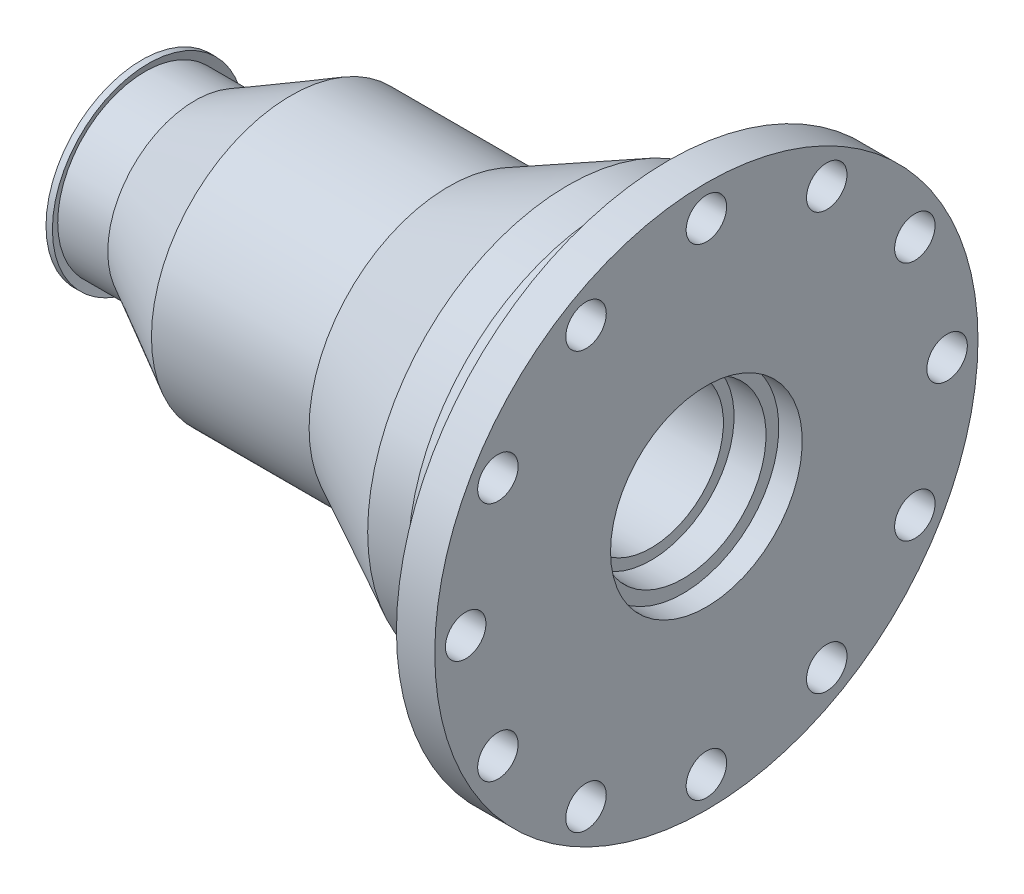
ISO-10303-21;
HEADER;
FILE_DESCRIPTION(('STEP AP214'),'2;1');
FILE_NAME('part.step','',(''),(''),'','','');
FILE_SCHEMA(('AUTOMOTIVE_DESIGN { 1 0 10303 214 1 1 1 1 }'));
ENDSEC;
DATA;
#1=APPLICATION_CONTEXT('core data for automotive mechanical design processes');
#2=APPLICATION_PROTOCOL_DEFINITION('international standard','automotive_design',2000,#1);
#3=PRODUCT_CONTEXT('',#1,'mechanical');
#4=PRODUCT('Part','Part','',(#3));
#5=PRODUCT_RELATED_PRODUCT_CATEGORY('part','',(#4));
#6=PRODUCT_DEFINITION_FORMATION('','',#4);
#7=PRODUCT_DEFINITION_CONTEXT('part definition',#1,'design');
#8=PRODUCT_DEFINITION('design','',#6,#7);
#9=PRODUCT_DEFINITION_SHAPE('','',#8);
#10=(LENGTH_UNIT() NAMED_UNIT(*) SI_UNIT(.MILLI.,.METRE.));
#11=(NAMED_UNIT(*) PLANE_ANGLE_UNIT() SI_UNIT($,.RADIAN.));
#12=(NAMED_UNIT(*) SI_UNIT($,.STERADIAN.) SOLID_ANGLE_UNIT());
#13=UNCERTAINTY_MEASURE_WITH_UNIT(LENGTH_MEASURE(1.E-05),#10,'distance_accuracy_value','');
#14=(GEOMETRIC_REPRESENTATION_CONTEXT(3) GLOBAL_UNCERTAINTY_ASSIGNED_CONTEXT((#13)) GLOBAL_UNIT_ASSIGNED_CONTEXT((#10,
#11,#12)) REPRESENTATION_CONTEXT('',''));
#15=CARTESIAN_POINT('',(0.,0.,0.));
#16=DIRECTION('',(0.,0.,1.));
#17=DIRECTION('',(1.,0.,0.));
#18=AXIS2_PLACEMENT_3D('',#15,#16,#17);
#19=CARTESIAN_POINT('',(0.,0.,0.));
#20=DIRECTION('',(1.,0.,0.));
#21=DIRECTION('',(0.,0.,-1.));
#22=AXIS2_PLACEMENT_3D('',#19,#20,#21);
#23=PLANE('',#22);
#24=CARTESIAN_POINT('',(0.,0.,0.));
#25=DIRECTION('',(-1.,0.,0.));
#26=DIRECTION('',(0.,0.,1.));
#27=AXIS2_PLACEMENT_3D('',#24,#25,#26);
#28=CIRCLE('',#27,31.);
#29=CARTESIAN_POINT('',(0.,0.,31.));
#30=VERTEX_POINT('',#29);
#31=EDGE_CURVE('E90',#30,#30,#28,.T.);
#32=ORIENTED_EDGE('',*,*,#31,.F.);
#33=EDGE_LOOP('',(#32));
#34=FACE_BOUND('',#33,.T.);
#35=CARTESIAN_POINT('',(0.,0.,0.));
#36=DIRECTION('',(-1.,0.,0.));
#37=DIRECTION('',(0.,0.,1.));
#38=AXIS2_PLACEMENT_3D('',#35,#36,#37);
#39=CIRCLE('',#38,45.);
#40=CARTESIAN_POINT('',(0.,0.,45.));
#41=VERTEX_POINT('',#40);
#42=EDGE_CURVE('E10',#41,#41,#39,.T.);
#43=ORIENTED_EDGE('',*,*,#42,.T.);
#44=EDGE_LOOP('',(#43));
#45=FACE_BOUND('',#44,.T.);
#46=ADVANCED_FACE('F41',(#34,#45),#23,.F.);
#47=CARTESIAN_POINT('',(0.,0.,0.));
#48=DIRECTION('',(-1.,0.,0.));
#49=DIRECTION('',(0.,0.,1.));
#50=AXIS2_PLACEMENT_3D('',#47,#48,#49);
#51=CYLINDRICAL_SURFACE('',#50,45.);
#52=ORIENTED_EDGE('',*,*,#42,.F.);
#53=EDGE_LOOP('',(#52));
#54=FACE_BOUND('',#53,.T.);
#55=CARTESIAN_POINT('',(3.,0.,0.));
#56=DIRECTION('',(-1.,0.,0.));
#57=DIRECTION('',(0.,0.,1.));
#58=AXIS2_PLACEMENT_3D('',#55,#56,#57);
#59=CIRCLE('',#58,45.);
#60=CARTESIAN_POINT('',(3.,0.,45.));
#61=VERTEX_POINT('',#60);
#62=EDGE_CURVE('E47',#61,#61,#59,.T.);
#63=ORIENTED_EDGE('',*,*,#62,.T.);
#64=EDGE_LOOP('',(#63));
#65=FACE_BOUND('',#64,.T.);
#66=ADVANCED_FACE('F235',(#54,#65),#51,.T.);
#67=CARTESIAN_POINT('',(1.5,0.,0.));
#68=DIRECTION('',(1.,0.,0.));
#69=DIRECTION('',(0.,0.,-1.));
#70=AXIS2_PLACEMENT_3D('',#67,#68,#69);
#71=CONICAL_SURFACE('',#70,41.,1.21202565652432);
#72=ORIENTED_EDGE('',*,*,#62,.F.);
#73=EDGE_LOOP('',(#72));
#74=FACE_BOUND('',#73,.T.);
#75=CARTESIAN_POINT('',(1.5,0.,0.));
#76=DIRECTION('',(-1.,0.,0.));
#77=DIRECTION('',(0.,0.,1.));
#78=AXIS2_PLACEMENT_3D('',#75,#76,#77);
#79=CIRCLE('',#78,41.);
#80=CARTESIAN_POINT('',(1.5,0.,41.));
#81=VERTEX_POINT('',#80);
#82=EDGE_CURVE('E51',#81,#81,#79,.T.);
#83=ORIENTED_EDGE('',*,*,#82,.T.);
#84=EDGE_LOOP('',(#83));
#85=FACE_BOUND('',#84,.T.);
#86=ADVANCED_FACE('F241',(#74,#85),#71,.F.);
#87=CARTESIAN_POINT('',(0.,0.,0.));
#88=DIRECTION('',(-1.,0.,0.));
#89=DIRECTION('',(0.,0.,1.));
#90=AXIS2_PLACEMENT_3D('',#87,#88,#89);
#91=CYLINDRICAL_SURFACE('',#90,41.);
#92=ORIENTED_EDGE('',*,*,#82,.F.);
#93=EDGE_LOOP('',(#92));
#94=FACE_BOUND('',#93,.T.);
#95=CARTESIAN_POINT('',(25.,0.,0.));
#96=DIRECTION('',(-1.,0.,0.));
#97=DIRECTION('',(0.,0.,1.));
#98=AXIS2_PLACEMENT_3D('',#95,#96,#97);
#99=CIRCLE('',#98,41.);
#100=CARTESIAN_POINT('',(25.,0.,41.));
#101=VERTEX_POINT('',#100);
#102=EDGE_CURVE('E55',#101,#101,#99,.T.);
#103=ORIENTED_EDGE('',*,*,#102,.T.);
#104=EDGE_LOOP('',(#103));
#105=FACE_BOUND('',#104,.T.);
#106=ADVANCED_FACE('F515',(#94,#105),#91,.T.);
#107=CARTESIAN_POINT('',(70.,0.,0.));
#108=DIRECTION('',(1.,0.,0.));
#109=DIRECTION('',(0.,0.,-1.));
#110=AXIS2_PLACEMENT_3D('',#107,#108,#109);
#111=CONICAL_SURFACE('',#110,65.5,0.498567905638218);
#112=ORIENTED_EDGE('',*,*,#102,.F.);
#113=EDGE_LOOP('',(#112));
#114=FACE_BOUND('',#113,.T.);
#115=CARTESIAN_POINT('',(70.,0.,0.));
#116=DIRECTION('',(-1.,0.,0.));
#117=DIRECTION('',(0.,0.,1.));
#118=AXIS2_PLACEMENT_3D('',#115,#116,#117);
#119=CIRCLE('',#118,65.5);
#120=CARTESIAN_POINT('',(70.,0.,65.5));
#121=VERTEX_POINT('',#120);
#122=EDGE_CURVE('E60',#121,#121,#119,.T.);
#123=ORIENTED_EDGE('',*,*,#122,.T.);
#124=EDGE_LOOP('',(#123));
#125=FACE_BOUND('',#124,.T.);
#126=ADVANCED_FACE('F506',(#114,#125),#111,.T.);
#127=CARTESIAN_POINT('',(0.,0.,0.));
#128=DIRECTION('',(-1.,0.,0.));
#129=DIRECTION('',(0.,0.,1.));
#130=AXIS2_PLACEMENT_3D('',#127,#128,#129);
#131=CYLINDRICAL_SURFACE('',#130,65.5);
#132=ORIENTED_EDGE('',*,*,#122,.F.);
#133=EDGE_LOOP('',(#132));
#134=FACE_BOUND('',#133,.T.);
#135=CARTESIAN_POINT('',(144.,0.,0.));
#136=DIRECTION('',(-1.,0.,0.));
#137=DIRECTION('',(0.,0.,1.));
#138=AXIS2_PLACEMENT_3D('',#135,#136,#137);
#139=CIRCLE('',#138,65.5);
#140=CARTESIAN_POINT('',(144.,0.,65.5));
#141=VERTEX_POINT('',#140);
#142=EDGE_CURVE('E63',#141,#141,#139,.T.);
#143=ORIENTED_EDGE('',*,*,#142,.T.);
#144=EDGE_LOOP('',(#143));
#145=FACE_BOUND('',#144,.T.);
#146=ADVANCED_FACE('F497',(#134,#145),#131,.T.);
#147=CARTESIAN_POINT('',(200.,0.,0.));
#148=DIRECTION('',(1.,0.,0.));
#149=DIRECTION('',(0.,0.,-1.));
#150=AXIS2_PLACEMENT_3D('',#147,#148,#149);
#151=CONICAL_SURFACE('',#150,94.,0.470764926542016);
#152=ORIENTED_EDGE('',*,*,#142,.F.);
#153=EDGE_LOOP('',(#152));
#154=FACE_BOUND('',#153,.T.);
#155=CARTESIAN_POINT('',(200.,0.,0.));
#156=DIRECTION('',(-1.,0.,0.));
#157=DIRECTION('',(0.,0.,1.));
#158=AXIS2_PLACEMENT_3D('',#155,#156,#157);
#159=CIRCLE('',#158,94.);
#160=CARTESIAN_POINT('',(200.,0.,94.));
#161=VERTEX_POINT('',#160);
#162=EDGE_CURVE('E66',#161,#161,#159,.T.);
#163=ORIENTED_EDGE('',*,*,#162,.T.);
#164=EDGE_LOOP('',(#163));
#165=FACE_BOUND('',#164,.T.);
#166=ADVANCED_FACE('F488',(#154,#165),#151,.T.);
#167=CARTESIAN_POINT('',(0.,0.,0.));
#168=DIRECTION('',(-1.,0.,0.));
#169=DIRECTION('',(0.,0.,1.));
#170=AXIS2_PLACEMENT_3D('',#167,#168,#169);
#171=CYLINDRICAL_SURFACE('',#170,94.);
#172=ORIENTED_EDGE('',*,*,#162,.F.);
#173=EDGE_LOOP('',(#172));
#174=FACE_BOUND('',#173,.T.);
#175=CARTESIAN_POINT('',(220.,0.,0.));
#176=DIRECTION('',(-1.,0.,0.));
#177=DIRECTION('',(0.,0.,1.));
#178=AXIS2_PLACEMENT_3D('',#175,#176,#177);
#179=CIRCLE('',#178,94.);
#180=CARTESIAN_POINT('',(220.,0.,94.));
#181=VERTEX_POINT('',#180);
#182=EDGE_CURVE('E69',#181,#181,#179,.T.);
#183=ORIENTED_EDGE('',*,*,#182,.T.);
#184=EDGE_LOOP('',(#183));
#185=FACE_BOUND('',#184,.T.);
#186=ADVANCED_FACE('F479',(#174,#185),#171,.T.);
#187=CARTESIAN_POINT('',(220.,94.,0.));
#188=DIRECTION('',(1.,0.,0.));
#189=DIRECTION('',(0.,0.,-1.));
#190=AXIS2_PLACEMENT_3D('',#187,#188,#189);
#191=PLANE('',#190);
#192=ORIENTED_EDGE('',*,*,#182,.F.);
#193=EDGE_LOOP('',(#192));
#194=FACE_BOUND('',#193,.T.);
#195=CARTESIAN_POINT('',(220.,0.,0.));
#196=DIRECTION('',(-1.,0.,0.));
#197=DIRECTION('',(0.,0.,1.));
#198=AXIS2_PLACEMENT_3D('',#195,#196,#197);
#199=CIRCLE('',#198,95.);
#200=CARTESIAN_POINT('',(220.,0.,95.));
#201=VERTEX_POINT('',#200);
#202=EDGE_CURVE('E72',#201,#201,#199,.T.);
#203=ORIENTED_EDGE('',*,*,#202,.T.);
#204=EDGE_LOOP('',(#203));
#205=FACE_BOUND('',#204,.T.);
#206=ADVANCED_FACE('F470',(#194,#205),#191,.F.);
#207=CARTESIAN_POINT('',(0.,0.,0.));
#208=DIRECTION('',(-1.,0.,0.));
#209=DIRECTION('',(0.,0.,1.));
#210=AXIS2_PLACEMENT_3D('',#207,#208,#209);
#211=CYLINDRICAL_SURFACE('',#210,95.);
#212=ORIENTED_EDGE('',*,*,#202,.F.);
#213=EDGE_LOOP('',(#212));
#214=FACE_BOUND('',#213,.T.);
#215=CARTESIAN_POINT('',(239.,0.,0.));
#216=DIRECTION('',(-1.,0.,0.));
#217=DIRECTION('',(0.,0.,1.));
#218=AXIS2_PLACEMENT_3D('',#215,#216,#217);
#219=CIRCLE('',#218,95.);
#220=CARTESIAN_POINT('',(239.,0.,95.));
#221=VERTEX_POINT('',#220);
#222=EDGE_CURVE('E75',#221,#221,#219,.T.);
#223=ORIENTED_EDGE('',*,*,#222,.T.);
#224=EDGE_LOOP('',(#223));
#225=FACE_BOUND('',#224,.T.);
#226=ADVANCED_FACE('F461',(#214,#225),#211,.T.);
#227=CARTESIAN_POINT('',(239.,95.,0.));
#228=DIRECTION('',(1.,0.,0.));
#229=DIRECTION('',(0.,0.,-1.));
#230=AXIS2_PLACEMENT_3D('',#227,#228,#229);
#231=PLANE('',#230);
#232=ORIENTED_EDGE('',*,*,#222,.F.);
#233=EDGE_LOOP('',(#232));
#234=FACE_BOUND('',#233,.T.);
#235=CARTESIAN_POINT('',(239.,0.,0.));
#236=DIRECTION('',(-1.,0.,0.));
#237=DIRECTION('',(0.,0.,1.));
#238=AXIS2_PLACEMENT_3D('',#235,#236,#237);
#239=CIRCLE('',#238,100.);
#240=CARTESIAN_POINT('',(239.,0.,100.));
#241=VERTEX_POINT('',#240);
#242=EDGE_CURVE('E78',#241,#241,#239,.T.);
#243=ORIENTED_EDGE('',*,*,#242,.T.);
#244=EDGE_LOOP('',(#243));
#245=FACE_BOUND('',#244,.T.);
#246=ADVANCED_FACE('F452',(#234,#245),#231,.F.);
#247=CARTESIAN_POINT('',(0.,0.,0.));
#248=DIRECTION('',(-1.,0.,0.));
#249=DIRECTION('',(0.,0.,1.));
#250=AXIS2_PLACEMENT_3D('',#247,#248,#249);
#251=CYLINDRICAL_SURFACE('',#250,100.);
#252=ORIENTED_EDGE('',*,*,#242,.F.);
#253=EDGE_LOOP('',(#252));
#254=FACE_BOUND('',#253,.T.);
#255=CARTESIAN_POINT('',(247.,0.,0.));
#256=DIRECTION('',(-1.,0.,0.));
#257=DIRECTION('',(0.,0.,1.));
#258=AXIS2_PLACEMENT_3D('',#255,#256,#257);
#259=CIRCLE('',#258,100.);
#260=CARTESIAN_POINT('',(247.,0.,100.));
#261=VERTEX_POINT('',#260);
#262=EDGE_CURVE('E81',#261,#261,#259,.T.);
#263=ORIENTED_EDGE('',*,*,#262,.T.);
#264=EDGE_LOOP('',(#263));
#265=FACE_BOUND('',#264,.T.);
#266=ADVANCED_FACE('F231',(#254,#265),#251,.T.);
#267=CARTESIAN_POINT('',(247.,100.,0.));
#268=DIRECTION('',(1.,0.,0.));
#269=DIRECTION('',(0.,0.,-1.));
#270=AXIS2_PLACEMENT_3D('',#267,#268,#269);
#271=PLANE('',#270);
#272=CARTESIAN_POINT('',(247.,97.8608706276416,-56.5));
#273=DIRECTION('',(1.,0.,0.));
#274=DIRECTION('',(0.,0.,-1.));
#275=AXIS2_PLACEMENT_3D('',#272,#273,#274);
#276=CIRCLE('',#275,9.50000000000001);
#277=CARTESIAN_POINT('',(247.,97.8608706276416,-66.));
#278=VERTEX_POINT('',#277);
#279=EDGE_CURVE('E180',#278,#278,#276,.F.);
#280=ORIENTED_EDGE('',*,*,#279,.F.);
#281=EDGE_LOOP('',(#280));
#282=FACE_BOUND('',#281,.T.);
#283=CARTESIAN_POINT('',(247.,56.4999999999999,-97.8608706276416));
#284=DIRECTION('',(1.,0.,0.));
#285=DIRECTION('',(0.,0.,-1.));
#286=AXIS2_PLACEMENT_3D('',#283,#284,#285);
#287=CIRCLE('',#286,9.5);
#288=CARTESIAN_POINT('',(247.,56.4999999999999,-107.360870627642));
#289=VERTEX_POINT('',#288);
#290=EDGE_CURVE('E174',#289,#289,#287,.F.);
#291=ORIENTED_EDGE('',*,*,#290,.F.);
#292=EDGE_LOOP('',(#291));
#293=FACE_BOUND('',#292,.T.);
#294=CARTESIAN_POINT('',(247.,0.,-113.));
#295=DIRECTION('',(1.,0.,0.));
#296=DIRECTION('',(0.,0.,-1.));
#297=AXIS2_PLACEMENT_3D('',#294,#295,#296);
#298=CIRCLE('',#297,9.49999999999999);
#299=CARTESIAN_POINT('',(247.,0.,-122.5));
#300=VERTEX_POINT('',#299);
#301=EDGE_CURVE('E168',#300,#300,#298,.F.);
#302=ORIENTED_EDGE('',*,*,#301,.F.);
#303=EDGE_LOOP('',(#302));
#304=FACE_BOUND('',#303,.T.);
#305=CARTESIAN_POINT('',(247.,-56.5,-97.8608706276415));
#306=DIRECTION('',(1.,0.,0.));
#307=DIRECTION('',(0.,0.,-1.));
#308=AXIS2_PLACEMENT_3D('',#305,#306,#307);
#309=CIRCLE('',#308,9.5);
#310=CARTESIAN_POINT('',(247.,-56.5,-107.360870627642));
#311=VERTEX_POINT('',#310);
#312=EDGE_CURVE('E162',#311,#311,#309,.F.);
#313=ORIENTED_EDGE('',*,*,#312,.F.);
#314=EDGE_LOOP('',(#313));
#315=FACE_BOUND('',#314,.T.);
#316=CARTESIAN_POINT('',(247.,-97.8608706276416,-56.5));
#317=DIRECTION('',(1.,0.,0.));
#318=DIRECTION('',(0.,0.,-1.));
#319=AXIS2_PLACEMENT_3D('',#316,#317,#318);
#320=CIRCLE('',#319,9.50000000000001);
#321=CARTESIAN_POINT('',(247.,-97.8608706276416,-66.));
#322=VERTEX_POINT('',#321);
#323=EDGE_CURVE('E156',#322,#322,#320,.F.);
#324=ORIENTED_EDGE('',*,*,#323,.F.);
#325=EDGE_LOOP('',(#324));
#326=FACE_BOUND('',#325,.T.);
#327=CARTESIAN_POINT('',(247.,-113.,0.));
#328=DIRECTION('',(1.,0.,0.));
#329=DIRECTION('',(0.,0.,-1.));
#330=AXIS2_PLACEMENT_3D('',#327,#328,#329);
#331=CIRCLE('',#330,9.49999999999998);
#332=CARTESIAN_POINT('',(247.,-113.,-9.49999999999998));
#333=VERTEX_POINT('',#332);
#334=EDGE_CURVE('E150',#333,#333,#331,.F.);
#335=ORIENTED_EDGE('',*,*,#334,.F.);
#336=EDGE_LOOP('',(#335));
#337=FACE_BOUND('',#336,.T.);
#338=CARTESIAN_POINT('',(247.,-97.8608706276415,56.5));
#339=DIRECTION('',(1.,0.,0.));
#340=DIRECTION('',(0.,0.,-1.));
#341=AXIS2_PLACEMENT_3D('',#338,#339,#340);
#342=CIRCLE('',#341,9.5);
#343=CARTESIAN_POINT('',(247.,-97.8608706276415,47.));
#344=VERTEX_POINT('',#343);
#345=EDGE_CURVE('E144',#344,#344,#342,.F.);
#346=ORIENTED_EDGE('',*,*,#345,.F.);
#347=EDGE_LOOP('',(#346));
#348=FACE_BOUND('',#347,.T.);
#349=CARTESIAN_POINT('',(247.,-56.5,97.8608706276416));
#350=DIRECTION('',(1.,0.,0.));
#351=DIRECTION('',(0.,0.,-1.));
#352=AXIS2_PLACEMENT_3D('',#349,#350,#351);
#353=CIRCLE('',#352,9.5);
#354=CARTESIAN_POINT('',(247.,-56.5,88.3608706276416));
#355=VERTEX_POINT('',#354);
#356=EDGE_CURVE('E138',#355,#355,#353,.F.);
#357=ORIENTED_EDGE('',*,*,#356,.F.);
#358=EDGE_LOOP('',(#357));
#359=FACE_BOUND('',#358,.T.);
#360=CARTESIAN_POINT('',(247.,0.,113.));
#361=DIRECTION('',(1.,0.,0.));
#362=DIRECTION('',(0.,0.,-1.));
#363=AXIS2_PLACEMENT_3D('',#360,#361,#362);
#364=CIRCLE('',#363,9.49999999999999);
#365=CARTESIAN_POINT('',(247.,0.,103.5));
#366=VERTEX_POINT('',#365);
#367=EDGE_CURVE('E132',#366,#366,#364,.F.);
#368=ORIENTED_EDGE('',*,*,#367,.F.);
#369=EDGE_LOOP('',(#368));
#370=FACE_BOUND('',#369,.T.);
#371=CARTESIAN_POINT('',(247.,56.5,97.8608706276416));
#372=DIRECTION('',(1.,0.,0.));
#373=DIRECTION('',(0.,0.,-1.));
#374=AXIS2_PLACEMENT_3D('',#371,#372,#373);
#375=CIRCLE('',#374,9.5);
#376=CARTESIAN_POINT('',(247.,56.5,88.3608706276416));
#377=VERTEX_POINT('',#376);
#378=EDGE_CURVE('E126',#377,#377,#375,.F.);
#379=ORIENTED_EDGE('',*,*,#378,.F.);
#380=EDGE_LOOP('',(#379));
#381=FACE_BOUND('',#380,.T.);
#382=CARTESIAN_POINT('',(247.,97.8608706276416,56.5));
#383=DIRECTION('',(1.,0.,0.));
#384=DIRECTION('',(0.,0.,-1.));
#385=AXIS2_PLACEMENT_3D('',#382,#383,#384);
#386=CIRCLE('',#385,9.5);
#387=CARTESIAN_POINT('',(247.,97.8608706276416,47.));
#388=VERTEX_POINT('',#387);
#389=EDGE_CURVE('E120',#388,#388,#386,.F.);
#390=ORIENTED_EDGE('',*,*,#389,.F.);
#391=EDGE_LOOP('',(#390));
#392=FACE_BOUND('',#391,.T.);
#393=CARTESIAN_POINT('',(247.,113.,0.));
#394=DIRECTION('',(1.,0.,0.));
#395=DIRECTION('',(0.,0.,-1.));
#396=AXIS2_PLACEMENT_3D('',#393,#394,#395);
#397=CIRCLE('',#396,9.50000000000001);
#398=CARTESIAN_POINT('',(247.,113.,-9.50000000000001));
#399=VERTEX_POINT('',#398);
#400=EDGE_CURVE('E114',#399,#399,#397,.F.);
#401=ORIENTED_EDGE('',*,*,#400,.F.);
#402=EDGE_LOOP('',(#401));
#403=FACE_BOUND('',#402,.T.);
#404=ORIENTED_EDGE('',*,*,#262,.F.);
#405=EDGE_LOOP('',(#404));
#406=FACE_BOUND('',#405,.T.);
#407=CARTESIAN_POINT('',(247.,0.,0.));
#408=DIRECTION('',(-1.,0.,0.));
#409=DIRECTION('',(0.,0.,1.));
#410=AXIS2_PLACEMENT_3D('',#407,#408,#409);
#411=CIRCLE('',#410,127.5);
#412=CARTESIAN_POINT('',(247.,0.,127.5));
#413=VERTEX_POINT('',#412);
#414=EDGE_CURVE('E84',#413,#413,#411,.T.);
#415=ORIENTED_EDGE('',*,*,#414,.T.);
#416=EDGE_LOOP('',(#415));
#417=FACE_BOUND('',#416,.T.);
#418=ADVANCED_FACE('F223',(#282,#293,#304,#315,#326,#337,#348,#359,#370,#381,#392,#403,#406,
#417),#271,.F.);
#419=CARTESIAN_POINT('',(0.,0.,0.));
#420=DIRECTION('',(-1.,0.,0.));
#421=DIRECTION('',(0.,0.,1.));
#422=AXIS2_PLACEMENT_3D('',#419,#420,#421);
#423=CYLINDRICAL_SURFACE('',#422,127.5);
#424=ORIENTED_EDGE('',*,*,#414,.F.);
#425=EDGE_LOOP('',(#424));
#426=FACE_BOUND('',#425,.T.);
#427=CARTESIAN_POINT('',(265.,0.,0.));
#428=DIRECTION('',(-1.,0.,0.));
#429=DIRECTION('',(0.,0.,1.));
#430=AXIS2_PLACEMENT_3D('',#427,#428,#429);
#431=CIRCLE('',#430,127.5);
#432=CARTESIAN_POINT('',(265.,0.,127.5));
#433=VERTEX_POINT('',#432);
#434=EDGE_CURVE('E87',#433,#433,#431,.T.);
#435=ORIENTED_EDGE('',*,*,#434,.T.);
#436=EDGE_LOOP('',(#435));
#437=FACE_BOUND('',#436,.T.);
#438=ADVANCED_FACE('F194',(#426,#437),#423,.T.);
#439=CARTESIAN_POINT('',(265.,127.5,0.));
#440=DIRECTION('',(-1.,0.,0.));
#441=DIRECTION('',(0.,0.,1.));
#442=AXIS2_PLACEMENT_3D('',#439,#440,#441);
#443=PLANE('',#442);
#444=CARTESIAN_POINT('',(265.,97.8608706276416,-56.5));
#445=DIRECTION('',(1.,0.,0.));
#446=DIRECTION('',(0.,0.,-1.));
#447=AXIS2_PLACEMENT_3D('',#444,#445,#446);
#448=CIRCLE('',#447,9.50000000000001);
#449=CARTESIAN_POINT('',(265.,97.8608706276416,-66.));
#450=VERTEX_POINT('',#449);
#451=EDGE_CURVE('E183',#450,#450,#448,.T.);
#452=ORIENTED_EDGE('',*,*,#451,.F.);
#453=EDGE_LOOP('',(#452));
#454=FACE_BOUND('',#453,.T.);
#455=CARTESIAN_POINT('',(265.,56.4999999999999,-97.8608706276416));
#456=DIRECTION('',(1.,0.,0.));
#457=DIRECTION('',(0.,0.,-1.));
#458=AXIS2_PLACEMENT_3D('',#455,#456,#457);
#459=CIRCLE('',#458,9.5);
#460=CARTESIAN_POINT('',(265.,56.4999999999999,-107.360870627642));
#461=VERTEX_POINT('',#460);
#462=EDGE_CURVE('E177',#461,#461,#459,.T.);
#463=ORIENTED_EDGE('',*,*,#462,.F.);
#464=EDGE_LOOP('',(#463));
#465=FACE_BOUND('',#464,.T.);
#466=CARTESIAN_POINT('',(265.,0.,-113.));
#467=DIRECTION('',(1.,0.,0.));
#468=DIRECTION('',(0.,0.,-1.));
#469=AXIS2_PLACEMENT_3D('',#466,#467,#468);
#470=CIRCLE('',#469,9.49999999999999);
#471=CARTESIAN_POINT('',(265.,0.,-122.5));
#472=VERTEX_POINT('',#471);
#473=EDGE_CURVE('E171',#472,#472,#470,.T.);
#474=ORIENTED_EDGE('',*,*,#473,.F.);
#475=EDGE_LOOP('',(#474));
#476=FACE_BOUND('',#475,.T.);
#477=CARTESIAN_POINT('',(265.,-56.5,-97.8608706276415));
#478=DIRECTION('',(1.,0.,0.));
#479=DIRECTION('',(0.,0.,-1.));
#480=AXIS2_PLACEMENT_3D('',#477,#478,#479);
#481=CIRCLE('',#480,9.5);
#482=CARTESIAN_POINT('',(265.,-56.5,-107.360870627642));
#483=VERTEX_POINT('',#482);
#484=EDGE_CURVE('E165',#483,#483,#481,.T.);
#485=ORIENTED_EDGE('',*,*,#484,.F.);
#486=EDGE_LOOP('',(#485));
#487=FACE_BOUND('',#486,.T.);
#488=CARTESIAN_POINT('',(265.,-97.8608706276416,-56.5));
#489=DIRECTION('',(1.,0.,0.));
#490=DIRECTION('',(0.,0.,-1.));
#491=AXIS2_PLACEMENT_3D('',#488,#489,#490);
#492=CIRCLE('',#491,9.50000000000001);
#493=CARTESIAN_POINT('',(265.,-97.8608706276416,-66.));
#494=VERTEX_POINT('',#493);
#495=EDGE_CURVE('E159',#494,#494,#492,.T.);
#496=ORIENTED_EDGE('',*,*,#495,.F.);
#497=EDGE_LOOP('',(#496));
#498=FACE_BOUND('',#497,.T.);
#499=CARTESIAN_POINT('',(265.,-113.,0.));
#500=DIRECTION('',(1.,0.,0.));
#501=DIRECTION('',(0.,0.,-1.));
#502=AXIS2_PLACEMENT_3D('',#499,#500,#501);
#503=CIRCLE('',#502,9.49999999999998);
#504=CARTESIAN_POINT('',(265.,-113.,-9.49999999999998));
#505=VERTEX_POINT('',#504);
#506=EDGE_CURVE('E153',#505,#505,#503,.T.);
#507=ORIENTED_EDGE('',*,*,#506,.F.);
#508=EDGE_LOOP('',(#507));
#509=FACE_BOUND('',#508,.T.);
#510=CARTESIAN_POINT('',(265.,-97.8608706276415,56.5));
#511=DIRECTION('',(1.,0.,0.));
#512=DIRECTION('',(0.,0.,-1.));
#513=AXIS2_PLACEMENT_3D('',#510,#511,#512);
#514=CIRCLE('',#513,9.5);
#515=CARTESIAN_POINT('',(265.,-97.8608706276415,47.));
#516=VERTEX_POINT('',#515);
#517=EDGE_CURVE('E147',#516,#516,#514,.T.);
#518=ORIENTED_EDGE('',*,*,#517,.F.);
#519=EDGE_LOOP('',(#518));
#520=FACE_BOUND('',#519,.T.);
#521=CARTESIAN_POINT('',(265.,-56.5,97.8608706276416));
#522=DIRECTION('',(1.,0.,0.));
#523=DIRECTION('',(0.,0.,-1.));
#524=AXIS2_PLACEMENT_3D('',#521,#522,#523);
#525=CIRCLE('',#524,9.5);
#526=CARTESIAN_POINT('',(265.,-56.5,88.3608706276416));
#527=VERTEX_POINT('',#526);
#528=EDGE_CURVE('E141',#527,#527,#525,.T.);
#529=ORIENTED_EDGE('',*,*,#528,.F.);
#530=EDGE_LOOP('',(#529));
#531=FACE_BOUND('',#530,.T.);
#532=CARTESIAN_POINT('',(265.,0.,113.));
#533=DIRECTION('',(1.,0.,0.));
#534=DIRECTION('',(0.,0.,-1.));
#535=AXIS2_PLACEMENT_3D('',#532,#533,#534);
#536=CIRCLE('',#535,9.49999999999999);
#537=CARTESIAN_POINT('',(265.,0.,103.5));
#538=VERTEX_POINT('',#537);
#539=EDGE_CURVE('E135',#538,#538,#536,.T.);
#540=ORIENTED_EDGE('',*,*,#539,.F.);
#541=EDGE_LOOP('',(#540));
#542=FACE_BOUND('',#541,.T.);
#543=CARTESIAN_POINT('',(265.,56.5,97.8608706276416));
#544=DIRECTION('',(1.,0.,0.));
#545=DIRECTION('',(0.,0.,-1.));
#546=AXIS2_PLACEMENT_3D('',#543,#544,#545);
#547=CIRCLE('',#546,9.5);
#548=CARTESIAN_POINT('',(265.,56.5,88.3608706276416));
#549=VERTEX_POINT('',#548);
#550=EDGE_CURVE('E129',#549,#549,#547,.T.);
#551=ORIENTED_EDGE('',*,*,#550,.F.);
#552=EDGE_LOOP('',(#551));
#553=FACE_BOUND('',#552,.T.);
#554=CARTESIAN_POINT('',(265.,97.8608706276416,56.5));
#555=DIRECTION('',(1.,0.,0.));
#556=DIRECTION('',(0.,0.,-1.));
#557=AXIS2_PLACEMENT_3D('',#554,#555,#556);
#558=CIRCLE('',#557,9.5);
#559=CARTESIAN_POINT('',(265.,97.8608706276416,47.));
#560=VERTEX_POINT('',#559);
#561=EDGE_CURVE('E123',#560,#560,#558,.T.);
#562=ORIENTED_EDGE('',*,*,#561,.F.);
#563=EDGE_LOOP('',(#562));
#564=FACE_BOUND('',#563,.T.);
#565=CARTESIAN_POINT('',(265.,113.,0.));
#566=DIRECTION('',(1.,0.,0.));
#567=DIRECTION('',(0.,0.,-1.));
#568=AXIS2_PLACEMENT_3D('',#565,#566,#567);
#569=CIRCLE('',#568,9.50000000000001);
#570=CARTESIAN_POINT('',(265.,113.,-9.50000000000001));
#571=VERTEX_POINT('',#570);
#572=EDGE_CURVE('E117',#571,#571,#569,.T.);
#573=ORIENTED_EDGE('',*,*,#572,.F.);
#574=EDGE_LOOP('',(#573));
#575=FACE_BOUND('',#574,.T.);
#576=CARTESIAN_POINT('',(265.,0.,0.));
#577=DIRECTION('',(-1.,0.,0.));
#578=DIRECTION('',(0.,0.,1.));
#579=AXIS2_PLACEMENT_3D('',#576,#577,#578);
#580=CIRCLE('',#579,45.);
#581=CARTESIAN_POINT('',(265.,0.,45.));
#582=VERTEX_POINT('',#581);
#583=EDGE_CURVE('E111',#582,#582,#580,.T.);
#584=ORIENTED_EDGE('',*,*,#583,.T.);
#585=EDGE_LOOP('',(#584));
#586=FACE_BOUND('',#585,.T.);
#587=ORIENTED_EDGE('',*,*,#434,.F.);
#588=EDGE_LOOP('',(#587));
#589=FACE_BOUND('',#588,.T.);
#590=ADVANCED_FACE('F190',(#454,#465,#476,#487,#498,#509,#520,#531,#542,#553,#564,#575,#586,
#589),#443,.F.);
#591=CARTESIAN_POINT('',(0.,0.,0.));
#592=DIRECTION('',(-1.,0.,0.));
#593=DIRECTION('',(0.,0.,1.));
#594=AXIS2_PLACEMENT_3D('',#591,#592,#593);
#595=CYLINDRICAL_SURFACE('',#594,31.);
#596=ORIENTED_EDGE('',*,*,#31,.T.);
#597=EDGE_LOOP('',(#596));
#598=FACE_BOUND('',#597,.T.);
#599=CARTESIAN_POINT('',(203.5,0.,0.));
#600=DIRECTION('',(-1.,0.,0.));
#601=DIRECTION('',(0.,0.,1.));
#602=AXIS2_PLACEMENT_3D('',#599,#600,#601);
#603=CIRCLE('',#602,31.);
#604=CARTESIAN_POINT('',(203.5,0.,31.));
#605=VERTEX_POINT('',#604);
#606=EDGE_CURVE('E93',#605,#605,#603,.T.);
#607=ORIENTED_EDGE('',*,*,#606,.F.);
#608=EDGE_LOOP('',(#607));
#609=FACE_BOUND('',#608,.T.);
#610=ADVANCED_FACE('F193',(#598,#609),#595,.F.);
#611=CARTESIAN_POINT('',(203.5,31.,0.));
#612=DIRECTION('',(1.,0.,0.));
#613=DIRECTION('',(0.,0.,-1.));
#614=AXIS2_PLACEMENT_3D('',#611,#612,#613);
#615=PLANE('',#614);
#616=ORIENTED_EDGE('',*,*,#606,.T.);
#617=EDGE_LOOP('',(#616));
#618=FACE_BOUND('',#617,.T.);
#619=CARTESIAN_POINT('',(203.5,0.,0.));
#620=DIRECTION('',(-1.,0.,0.));
#621=DIRECTION('',(0.,0.,1.));
#622=AXIS2_PLACEMENT_3D('',#619,#620,#621);
#623=CIRCLE('',#622,34.);
#624=CARTESIAN_POINT('',(203.5,0.,34.));
#625=VERTEX_POINT('',#624);
#626=EDGE_CURVE('E96',#625,#625,#623,.T.);
#627=ORIENTED_EDGE('',*,*,#626,.F.);
#628=EDGE_LOOP('',(#627));
#629=FACE_BOUND('',#628,.T.);
#630=ADVANCED_FACE('F246',(#618,#629),#615,.T.);
#631=CARTESIAN_POINT('',(0.,0.,0.));
#632=DIRECTION('',(-1.,0.,0.));
#633=DIRECTION('',(0.,0.,1.));
#634=AXIS2_PLACEMENT_3D('',#631,#632,#633);
#635=CYLINDRICAL_SURFACE('',#634,34.);
#636=ORIENTED_EDGE('',*,*,#626,.T.);
#637=EDGE_LOOP('',(#636));
#638=FACE_BOUND('',#637,.T.);
#639=CARTESIAN_POINT('',(239.,0.,0.));
#640=DIRECTION('',(-1.,0.,0.));
#641=DIRECTION('',(0.,0.,1.));
#642=AXIS2_PLACEMENT_3D('',#639,#640,#641);
#643=CIRCLE('',#642,34.);
#644=CARTESIAN_POINT('',(239.,0.,34.));
#645=VERTEX_POINT('',#644);
#646=EDGE_CURVE('E99',#645,#645,#643,.T.);
#647=ORIENTED_EDGE('',*,*,#646,.F.);
#648=EDGE_LOOP('',(#647));
#649=FACE_BOUND('',#648,.T.);
#650=ADVANCED_FACE('F252',(#638,#649),#635,.F.);
#651=CARTESIAN_POINT('',(239.,34.,0.));
#652=DIRECTION('',(1.,0.,0.));
#653=DIRECTION('',(0.,0.,-1.));
#654=AXIS2_PLACEMENT_3D('',#651,#652,#653);
#655=PLANE('',#654);
#656=ORIENTED_EDGE('',*,*,#646,.T.);
#657=EDGE_LOOP('',(#656));
#658=FACE_BOUND('',#657,.T.);
#659=CARTESIAN_POINT('',(239.,0.,0.));
#660=DIRECTION('',(-1.,0.,0.));
#661=DIRECTION('',(0.,0.,1.));
#662=AXIS2_PLACEMENT_3D('',#659,#660,#661);
#663=CIRCLE('',#662,39.);
#664=CARTESIAN_POINT('',(239.,0.,39.));
#665=VERTEX_POINT('',#664);
#666=EDGE_CURVE('E102',#665,#665,#663,.T.);
#667=ORIENTED_EDGE('',*,*,#666,.F.);
#668=EDGE_LOOP('',(#667));
#669=FACE_BOUND('',#668,.T.);
#670=ADVANCED_FACE('F258',(#658,#669),#655,.T.);
#671=CARTESIAN_POINT('',(0.,0.,0.));
#672=DIRECTION('',(-1.,0.,0.));
#673=DIRECTION('',(0.,0.,1.));
#674=AXIS2_PLACEMENT_3D('',#671,#672,#673);
#675=CYLINDRICAL_SURFACE('',#674,39.);
#676=ORIENTED_EDGE('',*,*,#666,.T.);
#677=EDGE_LOOP('',(#676));
#678=FACE_BOUND('',#677,.T.);
#679=CARTESIAN_POINT('',(254.,0.,0.));
#680=DIRECTION('',(-1.,0.,0.));
#681=DIRECTION('',(0.,0.,1.));
#682=AXIS2_PLACEMENT_3D('',#679,#680,#681);
#683=CIRCLE('',#682,39.);
#684=CARTESIAN_POINT('',(254.,0.,39.));
#685=VERTEX_POINT('',#684);
#686=EDGE_CURVE('E105',#685,#685,#683,.T.);
#687=ORIENTED_EDGE('',*,*,#686,.F.);
#688=EDGE_LOOP('',(#687));
#689=FACE_BOUND('',#688,.T.);
#690=ADVANCED_FACE('F264',(#678,#689),#675,.F.);
#691=CARTESIAN_POINT('',(254.,39.,0.));
#692=DIRECTION('',(1.,0.,0.));
#693=DIRECTION('',(0.,0.,-1.));
#694=AXIS2_PLACEMENT_3D('',#691,#692,#693);
#695=PLANE('',#694);
#696=ORIENTED_EDGE('',*,*,#686,.T.);
#697=EDGE_LOOP('',(#696));
#698=FACE_BOUND('',#697,.T.);
#699=CARTESIAN_POINT('',(254.,0.,0.));
#700=DIRECTION('',(-1.,0.,0.));
#701=DIRECTION('',(0.,0.,1.));
#702=AXIS2_PLACEMENT_3D('',#699,#700,#701);
#703=CIRCLE('',#702,45.);
#704=CARTESIAN_POINT('',(254.,0.,45.));
#705=VERTEX_POINT('',#704);
#706=EDGE_CURVE('E108',#705,#705,#703,.T.);
#707=ORIENTED_EDGE('',*,*,#706,.F.);
#708=EDGE_LOOP('',(#707));
#709=FACE_BOUND('',#708,.T.);
#710=ADVANCED_FACE('F270',(#698,#709),#695,.T.);
#711=CARTESIAN_POINT('',(0.,0.,0.));
#712=DIRECTION('',(-1.,0.,0.));
#713=DIRECTION('',(0.,0.,1.));
#714=AXIS2_PLACEMENT_3D('',#711,#712,#713);
#715=CYLINDRICAL_SURFACE('',#714,45.);
#716=ORIENTED_EDGE('',*,*,#706,.T.);
#717=EDGE_LOOP('',(#716));
#718=FACE_BOUND('',#717,.T.);
#719=ORIENTED_EDGE('',*,*,#583,.F.);
#720=EDGE_LOOP('',(#719));
#721=FACE_BOUND('',#720,.T.);
#722=ADVANCED_FACE('F276',(#718,#721),#715,.F.);
#723=CARTESIAN_POINT('',(265.,113.,0.));
#724=DIRECTION('',(-1.,0.,0.));
#725=DIRECTION('',(0.,0.,1.));
#726=AXIS2_PLACEMENT_3D('',#723,#724,#725);
#727=CYLINDRICAL_SURFACE('',#726,9.50000000000001);
#728=ORIENTED_EDGE('',*,*,#572,.T.);
#729=EDGE_LOOP('',(#728));
#730=FACE_BOUND('',#729,.T.);
#731=ORIENTED_EDGE('',*,*,#400,.T.);
#732=EDGE_LOOP('',(#731));
#733=FACE_BOUND('',#732,.T.);
#734=ADVANCED_FACE('F282',(#730,#733),#727,.F.);
#735=CARTESIAN_POINT('',(265.,97.8608706276416,56.5));
#736=DIRECTION('',(-1.,0.,0.));
#737=DIRECTION('',(0.,0.,1.));
#738=AXIS2_PLACEMENT_3D('',#735,#736,#737);
#739=CYLINDRICAL_SURFACE('',#738,9.5);
#740=ORIENTED_EDGE('',*,*,#561,.T.);
#741=EDGE_LOOP('',(#740));
#742=FACE_BOUND('',#741,.T.);
#743=ORIENTED_EDGE('',*,*,#389,.T.);
#744=EDGE_LOOP('',(#743));
#745=FACE_BOUND('',#744,.T.);
#746=ADVANCED_FACE('F287',(#742,#745),#739,.F.);
#747=CARTESIAN_POINT('',(265.,56.5,97.8608706276416));
#748=DIRECTION('',(-1.,0.,0.));
#749=DIRECTION('',(0.,0.,1.));
#750=AXIS2_PLACEMENT_3D('',#747,#748,#749);
#751=CYLINDRICAL_SURFACE('',#750,9.5);
#752=ORIENTED_EDGE('',*,*,#550,.T.);
#753=EDGE_LOOP('',(#752));
#754=FACE_BOUND('',#753,.T.);
#755=ORIENTED_EDGE('',*,*,#378,.T.);
#756=EDGE_LOOP('',(#755));
#757=FACE_BOUND('',#756,.T.);
#758=ADVANCED_FACE('F293',(#754,#757),#751,.F.);
#759=CARTESIAN_POINT('',(265.,0.,113.));
#760=DIRECTION('',(-1.,0.,0.));
#761=DIRECTION('',(0.,0.,1.));
#762=AXIS2_PLACEMENT_3D('',#759,#760,#761);
#763=CYLINDRICAL_SURFACE('',#762,9.49999999999999);
#764=ORIENTED_EDGE('',*,*,#539,.T.);
#765=EDGE_LOOP('',(#764));
#766=FACE_BOUND('',#765,.T.);
#767=ORIENTED_EDGE('',*,*,#367,.T.);
#768=EDGE_LOOP('',(#767));
#769=FACE_BOUND('',#768,.T.);
#770=ADVANCED_FACE('F297',(#766,#769),#763,.F.);
#771=CARTESIAN_POINT('',(265.,-56.5,97.8608706276416));
#772=DIRECTION('',(-1.,0.,0.));
#773=DIRECTION('',(0.,0.,1.));
#774=AXIS2_PLACEMENT_3D('',#771,#772,#773);
#775=CYLINDRICAL_SURFACE('',#774,9.5);
#776=ORIENTED_EDGE('',*,*,#528,.T.);
#777=EDGE_LOOP('',(#776));
#778=FACE_BOUND('',#777,.T.);
#779=ORIENTED_EDGE('',*,*,#356,.T.);
#780=EDGE_LOOP('',(#779));
#781=FACE_BOUND('',#780,.T.);
#782=ADVANCED_FACE('F301',(#778,#781),#775,.F.);
#783=CARTESIAN_POINT('',(265.,-97.8608706276415,56.5));
#784=DIRECTION('',(-1.,0.,0.));
#785=DIRECTION('',(0.,0.,1.));
#786=AXIS2_PLACEMENT_3D('',#783,#784,#785);
#787=CYLINDRICAL_SURFACE('',#786,9.5);
#788=ORIENTED_EDGE('',*,*,#517,.T.);
#789=EDGE_LOOP('',(#788));
#790=FACE_BOUND('',#789,.T.);
#791=ORIENTED_EDGE('',*,*,#345,.T.);
#792=EDGE_LOOP('',(#791));
#793=FACE_BOUND('',#792,.T.);
#794=ADVANCED_FACE('F305',(#790,#793),#787,.F.);
#795=CARTESIAN_POINT('',(265.,-113.,0.));
#796=DIRECTION('',(-1.,0.,0.));
#797=DIRECTION('',(0.,0.,1.));
#798=AXIS2_PLACEMENT_3D('',#795,#796,#797);
#799=CYLINDRICAL_SURFACE('',#798,9.49999999999998);
#800=ORIENTED_EDGE('',*,*,#506,.T.);
#801=EDGE_LOOP('',(#800));
#802=FACE_BOUND('',#801,.T.);
#803=ORIENTED_EDGE('',*,*,#334,.T.);
#804=EDGE_LOOP('',(#803));
#805=FACE_BOUND('',#804,.T.);
#806=ADVANCED_FACE('F309',(#802,#805),#799,.F.);
#807=CARTESIAN_POINT('',(265.,-97.8608706276416,-56.5));
#808=DIRECTION('',(-1.,0.,0.));
#809=DIRECTION('',(0.,0.,1.));
#810=AXIS2_PLACEMENT_3D('',#807,#808,#809);
#811=CYLINDRICAL_SURFACE('',#810,9.50000000000001);
#812=ORIENTED_EDGE('',*,*,#495,.T.);
#813=EDGE_LOOP('',(#812));
#814=FACE_BOUND('',#813,.T.);
#815=ORIENTED_EDGE('',*,*,#323,.T.);
#816=EDGE_LOOP('',(#815));
#817=FACE_BOUND('',#816,.T.);
#818=ADVANCED_FACE('F313',(#814,#817),#811,.F.);
#819=CARTESIAN_POINT('',(265.,-56.5,-97.8608706276415));
#820=DIRECTION('',(-1.,0.,0.));
#821=DIRECTION('',(0.,0.,1.));
#822=AXIS2_PLACEMENT_3D('',#819,#820,#821);
#823=CYLINDRICAL_SURFACE('',#822,9.5);
#824=ORIENTED_EDGE('',*,*,#484,.T.);
#825=EDGE_LOOP('',(#824));
#826=FACE_BOUND('',#825,.T.);
#827=ORIENTED_EDGE('',*,*,#312,.T.);
#828=EDGE_LOOP('',(#827));
#829=FACE_BOUND('',#828,.T.);
#830=ADVANCED_FACE('F317',(#826,#829),#823,.F.);
#831=CARTESIAN_POINT('',(265.,0.,-113.));
#832=DIRECTION('',(-1.,0.,0.));
#833=DIRECTION('',(0.,0.,1.));
#834=AXIS2_PLACEMENT_3D('',#831,#832,#833);
#835=CYLINDRICAL_SURFACE('',#834,9.49999999999999);
#836=ORIENTED_EDGE('',*,*,#473,.T.);
#837=EDGE_LOOP('',(#836));
#838=FACE_BOUND('',#837,.T.);
#839=ORIENTED_EDGE('',*,*,#301,.T.);
#840=EDGE_LOOP('',(#839));
#841=FACE_BOUND('',#840,.T.);
#842=ADVANCED_FACE('F321',(#838,#841),#835,.F.);
#843=CARTESIAN_POINT('',(265.,56.4999999999999,-97.8608706276416));
#844=DIRECTION('',(-1.,0.,0.));
#845=DIRECTION('',(0.,0.,1.));
#846=AXIS2_PLACEMENT_3D('',#843,#844,#845);
#847=CYLINDRICAL_SURFACE('',#846,9.5);
#848=ORIENTED_EDGE('',*,*,#462,.T.);
#849=EDGE_LOOP('',(#848));
#850=FACE_BOUND('',#849,.T.);
#851=ORIENTED_EDGE('',*,*,#290,.T.);
#852=EDGE_LOOP('',(#851));
#853=FACE_BOUND('',#852,.T.);
#854=ADVANCED_FACE('F325',(#850,#853),#847,.F.);
#855=CARTESIAN_POINT('',(265.,97.8608706276416,-56.5));
#856=DIRECTION('',(-1.,0.,0.));
#857=DIRECTION('',(0.,0.,1.));
#858=AXIS2_PLACEMENT_3D('',#855,#856,#857);
#859=CYLINDRICAL_SURFACE('',#858,9.50000000000001);
#860=ORIENTED_EDGE('',*,*,#451,.T.);
#861=EDGE_LOOP('',(#860));
#862=FACE_BOUND('',#861,.T.);
#863=ORIENTED_EDGE('',*,*,#279,.T.);
#864=EDGE_LOOP('',(#863));
#865=FACE_BOUND('',#864,.T.);
#866=ADVANCED_FACE('F187',(#862,#865),#859,.F.);
#867=CLOSED_SHELL('',(#46,#66,#86,#106,#126,#146,#166,#186,#206,#226,#246,#266,#418,#438,#590,
#610,#630,#650,#670,#690,#710,#722,#734,#746,#758,#770,#782,#794,#806,#818,#830,#842,#854,#866));
#868=MANIFOLD_SOLID_BREP('B2',#867);
#869=ADVANCED_BREP_SHAPE_REPRESENTATION('',(#18,#868),#14);
#870=SHAPE_DEFINITION_REPRESENTATION(#9,#869);
ENDSEC;
END-ISO-10303-21;
